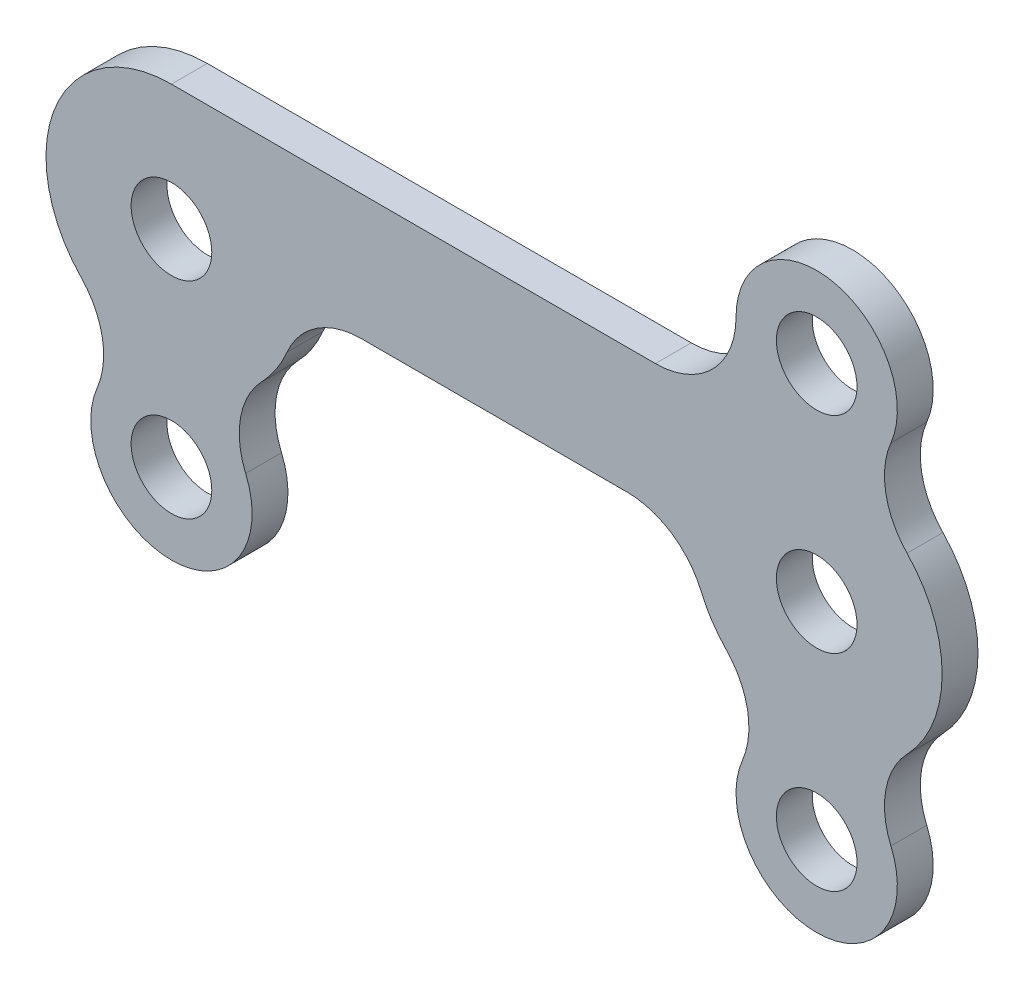
ISO-10303-21;
HEADER;
FILE_DESCRIPTION(('STEP AP214'),'2;1');
FILE_NAME('part.step','',(''),(''),'','','');
FILE_SCHEMA(('AUTOMOTIVE_DESIGN { 1 0 10303 214 1 1 1 1 }'));
ENDSEC;
DATA;
#1=APPLICATION_CONTEXT('core data for automotive mechanical design processes');
#2=APPLICATION_PROTOCOL_DEFINITION('international standard','automotive_design',2000,#1);
#3=PRODUCT_CONTEXT('',#1,'mechanical');
#4=PRODUCT('Part','Part','',(#3));
#5=PRODUCT_RELATED_PRODUCT_CATEGORY('part','',(#4));
#6=PRODUCT_DEFINITION_FORMATION('','',#4);
#7=PRODUCT_DEFINITION_CONTEXT('part definition',#1,'design');
#8=PRODUCT_DEFINITION('design','',#6,#7);
#9=PRODUCT_DEFINITION_SHAPE('','',#8);
#10=(LENGTH_UNIT() NAMED_UNIT(*) SI_UNIT(.MILLI.,.METRE.));
#11=(NAMED_UNIT(*) PLANE_ANGLE_UNIT() SI_UNIT($,.RADIAN.));
#12=(NAMED_UNIT(*) SI_UNIT($,.STERADIAN.) SOLID_ANGLE_UNIT());
#13=UNCERTAINTY_MEASURE_WITH_UNIT(LENGTH_MEASURE(1.E-05),#10,'distance_accuracy_value','');
#14=(GEOMETRIC_REPRESENTATION_CONTEXT(3) GLOBAL_UNCERTAINTY_ASSIGNED_CONTEXT((#13)) GLOBAL_UNIT_ASSIGNED_CONTEXT((#10,
#11,#12)) REPRESENTATION_CONTEXT('',''));
#15=CARTESIAN_POINT('',(0.,0.,0.));
#16=DIRECTION('',(0.,0.,1.));
#17=DIRECTION('',(1.,0.,0.));
#18=AXIS2_PLACEMENT_3D('',#15,#16,#17);
#19=CARTESIAN_POINT('',(35.149116844667,6.33274456521738,1.5875));
#20=DIRECTION('',(0.,0.,-1.));
#21=DIRECTION('',(-1.,0.,0.));
#22=AXIS2_PLACEMENT_3D('',#19,#20,#21);
#23=CYLINDRICAL_SURFACE('',#22,3.571875);
#24=CARTESIAN_POINT('',(35.149116844667,6.33274456521738,0.));
#25=DIRECTION('',(0.,0.,1.));
#26=DIRECTION('',(1.,0.,0.));
#27=AXIS2_PLACEMENT_3D('',#24,#25,#26);
#28=CIRCLE('',#27,3.571875);
#29=CARTESIAN_POINT('',(31.8620584223335,7.7304347826087,0.));
#30=VERTEX_POINT('',#29);
#31=CARTESIAN_POINT('',(32.5766363402321,3.8547140831758,0.));
#32=VERTEX_POINT('',#31);
#33=EDGE_CURVE('E165',#30,#32,#28,.T.);
#34=ORIENTED_EDGE('',*,*,#33,.F.);
#35=DIRECTION('',(0.,0.,-1.));
#36=VECTOR('',#35,1.);
#37=CARTESIAN_POINT('',(31.8620584223335,7.7304347826087,1.5875));
#38=LINE('',#37,#36);
#39=CARTESIAN_POINT('',(31.8620584223335,7.7304347826087,1.5875));
#40=VERTEX_POINT('',#39);
#41=EDGE_CURVE('E160',#40,#30,#38,.T.);
#42=ORIENTED_EDGE('',*,*,#41,.F.);
#43=CARTESIAN_POINT('',(35.149116844667,6.33274456521738,1.5875));
#44=DIRECTION('',(0.,0.,1.));
#45=DIRECTION('',(1.,0.,0.));
#46=AXIS2_PLACEMENT_3D('',#43,#44,#45);
#47=CIRCLE('',#46,3.571875);
#48=CARTESIAN_POINT('',(32.5766363402321,3.8547140831758,1.5875));
#49=VERTEX_POINT('',#48);
#50=EDGE_CURVE('E163',#40,#49,#47,.T.);
#51=ORIENTED_EDGE('',*,*,#50,.T.);
#52=DIRECTION('',(0.,0.,-1.));
#53=VECTOR('',#52,1.);
#54=CARTESIAN_POINT('',(32.5766363402321,3.8547140831758,1.5875));
#55=LINE('',#54,#53);
#56=EDGE_CURVE('E253',#49,#32,#55,.T.);
#57=ORIENTED_EDGE('',*,*,#56,.T.);
#58=EDGE_LOOP('',(#34,#42,#51,#57));
#59=FACE_BOUND('',#58,.T.);
#60=ADVANCED_FACE('F41',(#59),#23,.F.);
#61=CARTESIAN_POINT('',(28.575,9.12812500000001,1.5875));
#62=DIRECTION('',(0.,0.,-1.));
#63=DIRECTION('',(-1.,0.,0.));
#64=AXIS2_PLACEMENT_3D('',#61,#62,#63);
#65=CYLINDRICAL_SURFACE('',#64,3.57187499999999);
#66=CARTESIAN_POINT('',(28.575,9.12812500000001,0.));
#67=DIRECTION('',(0.,0.,1.));
#68=DIRECTION('',(1.,0.,0.));
#69=AXIS2_PLACEMENT_3D('',#66,#67,#68);
#70=CIRCLE('',#69,3.57187499999999);
#71=CARTESIAN_POINT('',(25.003125,9.12812500000001,0.));
#72=VERTEX_POINT('',#71);
#73=EDGE_CURVE('E256',#30,#72,#70,.T.);
#74=ORIENTED_EDGE('',*,*,#73,.T.);
#75=DIRECTION('',(0.,0.,-1.));
#76=VECTOR('',#75,1.);
#77=CARTESIAN_POINT('',(25.003125,9.12812500000001,1.5875));
#78=LINE('',#77,#76);
#79=CARTESIAN_POINT('',(25.003125,9.12812500000001,1.5875));
#80=VERTEX_POINT('',#79);
#81=EDGE_CURVE('E171',#80,#72,#78,.T.);
#82=ORIENTED_EDGE('',*,*,#81,.F.);
#83=CARTESIAN_POINT('',(28.575,9.12812500000001,1.5875));
#84=DIRECTION('',(0.,0.,1.));
#85=DIRECTION('',(1.,0.,0.));
#86=AXIS2_PLACEMENT_3D('',#83,#84,#85);
#87=CIRCLE('',#86,3.57187499999999);
#88=EDGE_CURVE('E174',#40,#80,#87,.T.);
#89=ORIENTED_EDGE('',*,*,#88,.F.);
#90=ORIENTED_EDGE('',*,*,#41,.T.);
#91=EDGE_LOOP('',(#74,#82,#89,#90));
#92=FACE_BOUND('',#91,.T.);
#93=ADVANCED_FACE('F175',(#92),#65,.T.);
#94=CARTESIAN_POINT('',(21.43125,9.12812500000001,1.5875));
#95=DIRECTION('',(0.,0.,-1.));
#96=DIRECTION('',(-1.,0.,0.));
#97=AXIS2_PLACEMENT_3D('',#94,#95,#96);
#98=CYLINDRICAL_SURFACE('',#97,3.571875);
#99=CARTESIAN_POINT('',(21.43125,9.12812500000001,0.));
#100=DIRECTION('',(0.,0.,1.));
#101=DIRECTION('',(1.,0.,0.));
#102=AXIS2_PLACEMENT_3D('',#99,#100,#101);
#103=CIRCLE('',#102,3.571875);
#104=CARTESIAN_POINT('',(21.43125,5.55625000000001,0.));
#105=VERTEX_POINT('',#104);
#106=EDGE_CURVE('E259',#105,#72,#103,.T.);
#107=ORIENTED_EDGE('',*,*,#106,.F.);
#108=DIRECTION('',(0.,0.,-1.));
#109=VECTOR('',#108,1.);
#110=CARTESIAN_POINT('',(21.43125,5.55625000000001,1.5875));
#111=LINE('',#110,#109);
#112=CARTESIAN_POINT('',(21.43125,5.55625000000001,1.5875));
#113=VERTEX_POINT('',#112);
#114=EDGE_CURVE('E349',#113,#105,#111,.T.);
#115=ORIENTED_EDGE('',*,*,#114,.F.);
#116=CARTESIAN_POINT('',(21.43125,9.12812500000001,1.5875));
#117=DIRECTION('',(0.,0.,1.));
#118=DIRECTION('',(1.,0.,0.));
#119=AXIS2_PLACEMENT_3D('',#116,#117,#118);
#120=CIRCLE('',#119,3.571875);
#121=EDGE_CURVE('E179',#113,#80,#120,.T.);
#122=ORIENTED_EDGE('',*,*,#121,.T.);
#123=ORIENTED_EDGE('',*,*,#81,.T.);
#124=EDGE_LOOP('',(#107,#115,#122,#123));
#125=FACE_BOUND('',#124,.T.);
#126=ADVANCED_FACE('F420',(#125),#98,.F.);
#127=CARTESIAN_POINT('',(0.,5.55625000000001,1.5875));
#128=DIRECTION('',(0.,1.,0.));
#129=DIRECTION('',(0.,0.,1.));
#130=AXIS2_PLACEMENT_3D('',#127,#128,#129);
#131=PLANE('',#130);
#132=DIRECTION('',(1.,0.,0.));
#133=VECTOR('',#132,1.);
#134=CARTESIAN_POINT('',(0.,5.55625000000001,0.));
#135=LINE('',#134,#133);
#136=CARTESIAN_POINT('',(0.,5.55625000000001,0.));
#137=VERTEX_POINT('',#136);
#138=EDGE_CURVE('E263',#137,#105,#135,.T.);
#139=ORIENTED_EDGE('',*,*,#138,.F.);
#140=DIRECTION('',(0.,0.,-1.));
#141=VECTOR('',#140,1.);
#142=CARTESIAN_POINT('',(0.,5.55625000000001,1.5875));
#143=LINE('',#142,#141);
#144=CARTESIAN_POINT('',(0.,5.55625000000001,1.5875));
#145=VERTEX_POINT('',#144);
#146=EDGE_CURVE('E346',#145,#137,#143,.T.);
#147=ORIENTED_EDGE('',*,*,#146,.F.);
#148=DIRECTION('',(1.,0.,0.));
#149=VECTOR('',#148,1.);
#150=CARTESIAN_POINT('',(0.,5.55625000000001,1.5875));
#151=LINE('',#150,#149);
#152=EDGE_CURVE('E197',#145,#113,#151,.T.);
#153=ORIENTED_EDGE('',*,*,#152,.T.);
#154=ORIENTED_EDGE('',*,*,#114,.T.);
#155=EDGE_LOOP('',(#139,#147,#153,#154));
#156=FACE_BOUND('',#155,.T.);
#157=ADVANCED_FACE('F423',(#156),#131,.T.);
#158=CARTESIAN_POINT('',(0.,0.,1.5875));
#159=DIRECTION('',(0.,0.,-1.));
#160=DIRECTION('',(-1.,0.,0.));
#161=AXIS2_PLACEMENT_3D('',#158,#159,#160);
#162=CYLINDRICAL_SURFACE('',#161,5.55625);
#163=CARTESIAN_POINT('',(0.,0.,0.));
#164=DIRECTION('',(0.,0.,1.));
#165=DIRECTION('',(1.,0.,0.));
#166=AXIS2_PLACEMENT_3D('',#163,#164,#165);
#167=CIRCLE('',#166,5.55625);
#168=CARTESIAN_POINT('',(-4.0016363402321,-3.8547140831758,0.));
#169=VERTEX_POINT('',#168);
#170=EDGE_CURVE('E267',#137,#169,#167,.T.);
#171=ORIENTED_EDGE('',*,*,#170,.T.);
#172=DIRECTION('',(0.,0.,-1.));
#173=VECTOR('',#172,1.);
#174=CARTESIAN_POINT('',(-4.0016363402321,-3.8547140831758,1.5875));
#175=LINE('',#174,#173);
#176=CARTESIAN_POINT('',(-4.0016363402321,-3.8547140831758,1.5875));
#177=VERTEX_POINT('',#176);
#178=EDGE_CURVE('E343',#177,#169,#175,.T.);
#179=ORIENTED_EDGE('',*,*,#178,.F.);
#180=CARTESIAN_POINT('',(0.,0.,1.5875));
#181=DIRECTION('',(0.,0.,1.));
#182=DIRECTION('',(1.,0.,0.));
#183=AXIS2_PLACEMENT_3D('',#180,#181,#182);
#184=CIRCLE('',#183,5.55625);
#185=EDGE_CURVE('E201',#145,#177,#184,.T.);
#186=ORIENTED_EDGE('',*,*,#185,.F.);
#187=ORIENTED_EDGE('',*,*,#146,.T.);
#188=EDGE_LOOP('',(#171,#179,#186,#187));
#189=FACE_BOUND('',#188,.T.);
#190=ADVANCED_FACE('F427',(#189),#162,.T.);
#191=CARTESIAN_POINT('',(-6.57411684466701,-6.33274456521737,1.5875));
#192=DIRECTION('',(0.,0.,-1.));
#193=DIRECTION('',(-1.,0.,0.));
#194=AXIS2_PLACEMENT_3D('',#191,#192,#193);
#195=CYLINDRICAL_SURFACE('',#194,3.57187499999999);
#196=CARTESIAN_POINT('',(-6.57411684466701,-6.33274456521737,0.));
#197=DIRECTION('',(0.,0.,1.));
#198=DIRECTION('',(1.,0.,0.));
#199=AXIS2_PLACEMENT_3D('',#196,#197,#198);
#200=CIRCLE('',#199,3.57187499999999);
#201=CARTESIAN_POINT('',(-3.2870584223335,-7.73043478260869,0.));
#202=VERTEX_POINT('',#201);
#203=EDGE_CURVE('E271',#202,#169,#200,.T.);
#204=ORIENTED_EDGE('',*,*,#203,.F.);
#205=DIRECTION('',(0.,0.,-1.));
#206=VECTOR('',#205,1.);
#207=CARTESIAN_POINT('',(-3.2870584223335,-7.73043478260869,1.5875));
#208=LINE('',#207,#206);
#209=CARTESIAN_POINT('',(-3.2870584223335,-7.73043478260869,1.5875));
#210=VERTEX_POINT('',#209);
#211=EDGE_CURVE('E340',#210,#202,#208,.T.);
#212=ORIENTED_EDGE('',*,*,#211,.F.);
#213=CARTESIAN_POINT('',(-6.57411684466701,-6.33274456521737,1.5875));
#214=DIRECTION('',(0.,0.,1.));
#215=DIRECTION('',(1.,0.,0.));
#216=AXIS2_PLACEMENT_3D('',#213,#214,#215);
#217=CIRCLE('',#216,3.57187499999999);
#218=EDGE_CURVE('E204',#210,#177,#217,.T.);
#219=ORIENTED_EDGE('',*,*,#218,.T.);
#220=ORIENTED_EDGE('',*,*,#178,.T.);
#221=EDGE_LOOP('',(#204,#212,#219,#220));
#222=FACE_BOUND('',#221,.T.);
#223=ADVANCED_FACE('F433',(#222),#195,.F.);
#224=CARTESIAN_POINT('',(0.,-9.12812499999999,1.5875));
#225=DIRECTION('',(0.,0.,-1.));
#226=DIRECTION('',(-1.,0.,0.));
#227=AXIS2_PLACEMENT_3D('',#224,#225,#226);
#228=CYLINDRICAL_SURFACE('',#227,3.57187499999999);
#229=CARTESIAN_POINT('',(0.,-9.12812499999999,0.));
#230=DIRECTION('',(0.,0.,1.));
#231=DIRECTION('',(1.,0.,0.));
#232=AXIS2_PLACEMENT_3D('',#229,#230,#231);
#233=CIRCLE('',#232,3.57187499999999);
#234=CARTESIAN_POINT('',(3.2870584223335,-7.7304347826087,0.));
#235=VERTEX_POINT('',#234);
#236=EDGE_CURVE('E276',#202,#235,#233,.T.);
#237=ORIENTED_EDGE('',*,*,#236,.T.);
#238=DIRECTION('',(0.,0.,-1.));
#239=VECTOR('',#238,1.);
#240=CARTESIAN_POINT('',(3.2870584223335,-7.7304347826087,1.5875));
#241=LINE('',#240,#239);
#242=CARTESIAN_POINT('',(3.2870584223335,-7.7304347826087,1.5875));
#243=VERTEX_POINT('',#242);
#244=EDGE_CURVE('E337',#243,#235,#241,.T.);
#245=ORIENTED_EDGE('',*,*,#244,.F.);
#246=CARTESIAN_POINT('',(0.,-9.12812499999999,1.5875));
#247=DIRECTION('',(0.,0.,1.));
#248=DIRECTION('',(1.,0.,0.));
#249=AXIS2_PLACEMENT_3D('',#246,#247,#248);
#250=CIRCLE('',#249,3.57187499999999);
#251=EDGE_CURVE('E209',#210,#243,#250,.T.);
#252=ORIENTED_EDGE('',*,*,#251,.F.);
#253=ORIENTED_EDGE('',*,*,#211,.T.);
#254=EDGE_LOOP('',(#237,#245,#252,#253));
#255=FACE_BOUND('',#254,.T.);
#256=ADVANCED_FACE('F436',(#255),#228,.T.);
#257=CARTESIAN_POINT('',(6.57411684466702,-6.33274456521739,1.5875));
#258=DIRECTION('',(0.,0.,-1.));
#259=DIRECTION('',(-1.,0.,0.));
#260=AXIS2_PLACEMENT_3D('',#257,#258,#259);
#261=CYLINDRICAL_SURFACE('',#260,3.57187500000001);
#262=CARTESIAN_POINT('',(6.57411684466702,-6.33274456521739,0.));
#263=DIRECTION('',(0.,0.,1.));
#264=DIRECTION('',(1.,0.,0.));
#265=AXIS2_PLACEMENT_3D('',#262,#263,#264);
#266=CIRCLE('',#265,3.57187500000001);
#267=CARTESIAN_POINT('',(4.0016363402321,-3.8547140831758,0.));
#268=VERTEX_POINT('',#267);
#269=EDGE_CURVE('E280',#268,#235,#266,.T.);
#270=ORIENTED_EDGE('',*,*,#269,.F.);
#271=DIRECTION('',(0.,0.,-1.));
#272=VECTOR('',#271,1.);
#273=CARTESIAN_POINT('',(4.0016363402321,-3.8547140831758,1.5875));
#274=LINE('',#273,#272);
#275=CARTESIAN_POINT('',(4.0016363402321,-3.8547140831758,1.5875));
#276=VERTEX_POINT('',#275);
#277=EDGE_CURVE('E334',#276,#268,#274,.T.);
#278=ORIENTED_EDGE('',*,*,#277,.F.);
#279=CARTESIAN_POINT('',(6.57411684466702,-6.33274456521739,1.5875));
#280=DIRECTION('',(0.,0.,1.));
#281=DIRECTION('',(1.,0.,0.));
#282=AXIS2_PLACEMENT_3D('',#279,#280,#281);
#283=CIRCLE('',#282,3.57187500000001);
#284=EDGE_CURVE('E212',#276,#243,#283,.T.);
#285=ORIENTED_EDGE('',*,*,#284,.T.);
#286=ORIENTED_EDGE('',*,*,#244,.T.);
#287=EDGE_LOOP('',(#270,#278,#285,#286));
#288=FACE_BOUND('',#287,.T.);
#289=ADVANCED_FACE('F438',(#288),#261,.F.);
#290=CARTESIAN_POINT('',(5.11320199029657,-2.17418478260869,0.));
#291=VERTEX_POINT('',#290);
#292=EDGE_CURVE('E272',#268,#291,#167,.T.);
#293=ORIENTED_EDGE('',*,*,#292,.T.);
#294=DIRECTION('',(0.,0.,-1.));
#295=VECTOR('',#294,1.);
#296=CARTESIAN_POINT('',(5.11320199029657,-2.17418478260869,1.5875));
#297=LINE('',#296,#295);
#298=CARTESIAN_POINT('',(5.11320199029657,-2.17418478260869,1.5875));
#299=VERTEX_POINT('',#298);
#300=EDGE_CURVE('E360',#291,#299,#297,.F.);
#301=ORIENTED_EDGE('',*,*,#300,.T.);
#302=EDGE_CURVE('E205',#276,#299,#184,.T.);
#303=ORIENTED_EDGE('',*,*,#302,.F.);
#304=ORIENTED_EDGE('',*,*,#277,.T.);
#305=EDGE_LOOP('',(#293,#301,#303,#304));
#306=FACE_BOUND('',#305,.T.);
#307=ADVANCED_FACE('F413',(#306),#162,.T.);
#308=CARTESIAN_POINT('',(0.,0.,1.5875));
#309=DIRECTION('',(0.,1.,0.));
#310=DIRECTION('',(0.,0.,1.));
#311=AXIS2_PLACEMENT_3D('',#308,#309,#310);
#312=PLANE('',#311);
#313=DIRECTION('',(1.,0.,0.));
#314=VECTOR('',#313,1.);
#315=CARTESIAN_POINT('',(0.,0.,1.5875));
#316=LINE('',#315,#314);
#317=CARTESIAN_POINT('',(8.40026041263007,0.,1.5875));
#318=VERTEX_POINT('',#317);
#319=CARTESIAN_POINT('',(20.1747395873699,0.,1.5875));
#320=VERTEX_POINT('',#319);
#321=EDGE_CURVE('E216',#318,#320,#316,.T.);
#322=ORIENTED_EDGE('',*,*,#321,.F.);
#323=DIRECTION('',(0.,0.,1.));
#324=VECTOR('',#323,1.);
#325=CARTESIAN_POINT('',(8.40026041263007,0.,0.));
#326=LINE('',#325,#324);
#327=CARTESIAN_POINT('',(8.40026041263007,0.,0.));
#328=VERTEX_POINT('',#327);
#329=EDGE_CURVE('E356',#318,#328,#326,.F.);
#330=ORIENTED_EDGE('',*,*,#329,.T.);
#331=DIRECTION('',(1.,0.,0.));
#332=VECTOR('',#331,1.);
#333=CARTESIAN_POINT('',(0.,0.,0.));
#334=LINE('',#333,#332);
#335=CARTESIAN_POINT('',(20.1747395873699,0.,0.));
#336=VERTEX_POINT('',#335);
#337=EDGE_CURVE('E284',#328,#336,#334,.T.);
#338=ORIENTED_EDGE('',*,*,#337,.T.);
#339=DIRECTION('',(0.,0.,1.));
#340=VECTOR('',#339,1.);
#341=CARTESIAN_POINT('',(20.1747395873699,0.,1.5875));
#342=LINE('',#341,#340);
#343=EDGE_CURVE('E170',#336,#320,#342,.T.);
#344=ORIENTED_EDGE('',*,*,#343,.T.);
#345=EDGE_LOOP('',(#322,#330,#338,#344));
#346=FACE_BOUND('',#345,.T.);
#347=ADVANCED_FACE('F379',(#346),#312,.F.);
#348=CARTESIAN_POINT('',(28.575,0.,1.5875));
#349=DIRECTION('',(0.,0.,-1.));
#350=DIRECTION('',(-1.,0.,0.));
#351=AXIS2_PLACEMENT_3D('',#348,#349,#350);
#352=CYLINDRICAL_SURFACE('',#351,5.55624999999999);
#353=CARTESIAN_POINT('',(28.575,0.,1.5875));
#354=DIRECTION('',(0.,0.,1.));
#355=DIRECTION('',(1.,0.,0.));
#356=AXIS2_PLACEMENT_3D('',#353,#354,#355);
#357=CIRCLE('',#356,5.55624999999999);
#358=CARTESIAN_POINT('',(23.4617980097034,-2.1741847826087,1.5875));
#359=VERTEX_POINT('',#358);
#360=CARTESIAN_POINT('',(24.5733636597679,-3.85471408317579,1.5875));
#361=VERTEX_POINT('',#360);
#362=EDGE_CURVE('E219',#359,#361,#357,.T.);
#363=ORIENTED_EDGE('',*,*,#362,.F.);
#364=DIRECTION('',(0.,0.,-1.));
#365=VECTOR('',#364,1.);
#366=CARTESIAN_POINT('',(23.4617980097034,-2.17418478260869,1.5875));
#367=LINE('',#366,#365);
#368=CARTESIAN_POINT('',(23.4617980097034,-2.1741847826087,0.));
#369=VERTEX_POINT('',#368);
#370=EDGE_CURVE('E363',#359,#369,#367,.T.);
#371=ORIENTED_EDGE('',*,*,#370,.T.);
#372=CARTESIAN_POINT('',(28.575,0.,0.));
#373=DIRECTION('',(0.,0.,1.));
#374=DIRECTION('',(1.,0.,0.));
#375=AXIS2_PLACEMENT_3D('',#372,#373,#374);
#376=CIRCLE('',#375,5.55624999999999);
#377=CARTESIAN_POINT('',(24.5733636597679,-3.85471408317579,0.));
#378=VERTEX_POINT('',#377);
#379=EDGE_CURVE('E288',#369,#378,#376,.T.);
#380=ORIENTED_EDGE('',*,*,#379,.T.);
#381=DIRECTION('',(0.,0.,-1.));
#382=VECTOR('',#381,1.);
#383=CARTESIAN_POINT('',(24.5733636597679,-3.85471408317579,1.5875));
#384=LINE('',#383,#382);
#385=EDGE_CURVE('E330',#361,#378,#384,.T.);
#386=ORIENTED_EDGE('',*,*,#385,.F.);
#387=EDGE_LOOP('',(#363,#371,#380,#386));
#388=FACE_BOUND('',#387,.T.);
#389=ADVANCED_FACE('F382',(#388),#352,.T.);
#390=CARTESIAN_POINT('',(22.000883155333,-6.33274456521738,1.5875));
#391=DIRECTION('',(0.,0.,-1.));
#392=DIRECTION('',(-1.,0.,0.));
#393=AXIS2_PLACEMENT_3D('',#390,#391,#392);
#394=CYLINDRICAL_SURFACE('',#393,3.57187499999999);
#395=CARTESIAN_POINT('',(22.000883155333,-6.33274456521738,0.));
#396=DIRECTION('',(0.,0.,1.));
#397=DIRECTION('',(1.,0.,0.));
#398=AXIS2_PLACEMENT_3D('',#395,#396,#397);
#399=CIRCLE('',#398,3.57187499999999);
#400=CARTESIAN_POINT('',(25.2879415776665,-7.73043478260869,0.));
#401=VERTEX_POINT('',#400);
#402=EDGE_CURVE('E291',#401,#378,#399,.T.);
#403=ORIENTED_EDGE('',*,*,#402,.F.);
#404=DIRECTION('',(0.,0.,-1.));
#405=VECTOR('',#404,1.);
#406=CARTESIAN_POINT('',(25.2879415776665,-7.73043478260869,1.5875));
#407=LINE('',#406,#405);
#408=CARTESIAN_POINT('',(25.2879415776665,-7.73043478260869,1.5875));
#409=VERTEX_POINT('',#408);
#410=EDGE_CURVE('E327',#409,#401,#407,.T.);
#411=ORIENTED_EDGE('',*,*,#410,.F.);
#412=CARTESIAN_POINT('',(22.000883155333,-6.33274456521738,1.5875));
#413=DIRECTION('',(0.,0.,1.));
#414=DIRECTION('',(1.,0.,0.));
#415=AXIS2_PLACEMENT_3D('',#412,#413,#414);
#416=CIRCLE('',#415,3.57187499999999);
#417=EDGE_CURVE('E222',#409,#361,#416,.T.);
#418=ORIENTED_EDGE('',*,*,#417,.T.);
#419=ORIENTED_EDGE('',*,*,#385,.T.);
#420=EDGE_LOOP('',(#403,#411,#418,#419));
#421=FACE_BOUND('',#420,.T.);
#422=ADVANCED_FACE('F389',(#421),#394,.F.);
#423=CARTESIAN_POINT('',(28.575,-9.12812499999999,1.5875));
#424=DIRECTION('',(0.,0.,-1.));
#425=DIRECTION('',(-1.,0.,0.));
#426=AXIS2_PLACEMENT_3D('',#423,#424,#425);
#427=CYLINDRICAL_SURFACE('',#426,3.57187499999999);
#428=CARTESIAN_POINT('',(28.575,-9.12812499999999,0.));
#429=DIRECTION('',(0.,0.,1.));
#430=DIRECTION('',(1.,0.,0.));
#431=AXIS2_PLACEMENT_3D('',#428,#429,#430);
#432=CIRCLE('',#431,3.57187499999999);
#433=CARTESIAN_POINT('',(31.8620584223335,-7.73043478260869,0.));
#434=VERTEX_POINT('',#433);
#435=EDGE_CURVE('E296',#401,#434,#432,.T.);
#436=ORIENTED_EDGE('',*,*,#435,.T.);
#437=DIRECTION('',(0.,0.,-1.));
#438=VECTOR('',#437,1.);
#439=CARTESIAN_POINT('',(31.8620584223335,-7.73043478260869,1.5875));
#440=LINE('',#439,#438);
#441=CARTESIAN_POINT('',(31.8620584223335,-7.73043478260869,1.5875));
#442=VERTEX_POINT('',#441);
#443=EDGE_CURVE('E324',#442,#434,#440,.T.);
#444=ORIENTED_EDGE('',*,*,#443,.F.);
#445=CARTESIAN_POINT('',(28.575,-9.12812499999999,1.5875));
#446=DIRECTION('',(0.,0.,1.));
#447=DIRECTION('',(1.,0.,0.));
#448=AXIS2_PLACEMENT_3D('',#445,#446,#447);
#449=CIRCLE('',#448,3.57187499999999);
#450=EDGE_CURVE('E226',#409,#442,#449,.T.);
#451=ORIENTED_EDGE('',*,*,#450,.F.);
#452=ORIENTED_EDGE('',*,*,#410,.T.);
#453=EDGE_LOOP('',(#436,#444,#451,#452));
#454=FACE_BOUND('',#453,.T.);
#455=ADVANCED_FACE('F392',(#454),#427,.T.);
#456=CARTESIAN_POINT('',(35.149116844667,-6.33274456521738,1.5875));
#457=DIRECTION('',(0.,0.,-1.));
#458=DIRECTION('',(-1.,0.,0.));
#459=AXIS2_PLACEMENT_3D('',#456,#457,#458);
#460=CYLINDRICAL_SURFACE('',#459,3.571875);
#461=CARTESIAN_POINT('',(35.149116844667,-6.33274456521738,0.));
#462=DIRECTION('',(0.,0.,1.));
#463=DIRECTION('',(1.,0.,0.));
#464=AXIS2_PLACEMENT_3D('',#461,#462,#463);
#465=CIRCLE('',#464,3.571875);
#466=CARTESIAN_POINT('',(32.5766363402321,-3.85471408317579,0.));
#467=VERTEX_POINT('',#466);
#468=EDGE_CURVE('E300',#467,#434,#465,.T.);
#469=ORIENTED_EDGE('',*,*,#468,.F.);
#470=DIRECTION('',(0.,0.,-1.));
#471=VECTOR('',#470,1.);
#472=CARTESIAN_POINT('',(32.5766363402321,-3.85471408317579,1.5875));
#473=LINE('',#472,#471);
#474=CARTESIAN_POINT('',(32.5766363402321,-3.85471408317579,1.5875));
#475=VERTEX_POINT('',#474);
#476=EDGE_CURVE('E321',#475,#467,#473,.T.);
#477=ORIENTED_EDGE('',*,*,#476,.F.);
#478=CARTESIAN_POINT('',(35.149116844667,-6.33274456521738,1.5875));
#479=DIRECTION('',(0.,0.,1.));
#480=DIRECTION('',(1.,0.,0.));
#481=AXIS2_PLACEMENT_3D('',#478,#479,#480);
#482=CIRCLE('',#481,3.571875);
#483=EDGE_CURVE('E229',#475,#442,#482,.T.);
#484=ORIENTED_EDGE('',*,*,#483,.T.);
#485=ORIENTED_EDGE('',*,*,#443,.T.);
#486=EDGE_LOOP('',(#469,#477,#484,#485));
#487=FACE_BOUND('',#486,.T.);
#488=ADVANCED_FACE('F395',(#487),#460,.F.);
#489=CARTESIAN_POINT('',(28.575,9.12812500000001,1.5875));
#490=DIRECTION('',(0.,0.,-1.));
#491=DIRECTION('',(-1.,0.,0.));
#492=AXIS2_PLACEMENT_3D('',#489,#490,#491);
#493=CYLINDRICAL_SURFACE('',#492,1.7859375);
#494=CARTESIAN_POINT('',(28.575,9.12812500000001,1.5875));
#495=DIRECTION('',(0.,0.,1.));
#496=DIRECTION('',(1.,0.,0.));
#497=AXIS2_PLACEMENT_3D('',#494,#495,#496);
#498=CIRCLE('',#497,1.7859375);
#499=CARTESIAN_POINT('',(30.3609375,9.12812500000001,1.5875));
#500=VERTEX_POINT('',#499);
#501=EDGE_CURVE('E245',#500,#500,#498,.T.);
#502=ORIENTED_EDGE('',*,*,#501,.T.);
#503=EDGE_LOOP('',(#502));
#504=FACE_BOUND('',#503,.T.);
#505=CARTESIAN_POINT('',(28.575,9.12812500000001,0.));
#506=DIRECTION('',(0.,0.,1.));
#507=DIRECTION('',(1.,0.,0.));
#508=AXIS2_PLACEMENT_3D('',#505,#506,#507);
#509=CIRCLE('',#508,1.7859375);
#510=CARTESIAN_POINT('',(30.3609375,9.12812500000001,0.));
#511=VERTEX_POINT('',#510);
#512=EDGE_CURVE('E192',#511,#511,#509,.T.);
#513=ORIENTED_EDGE('',*,*,#512,.F.);
#514=EDGE_LOOP('',(#513));
#515=FACE_BOUND('',#514,.T.);
#516=ADVANCED_FACE('F469',(#504,#515),#493,.F.);
#517=CARTESIAN_POINT('',(28.575,0.,1.5875));
#518=DIRECTION('',(0.,0.,-1.));
#519=DIRECTION('',(-1.,0.,0.));
#520=AXIS2_PLACEMENT_3D('',#517,#518,#519);
#521=CYLINDRICAL_SURFACE('',#520,1.7859375);
#522=CARTESIAN_POINT('',(28.575,0.,1.5875));
#523=DIRECTION('',(0.,0.,1.));
#524=DIRECTION('',(1.,0.,0.));
#525=AXIS2_PLACEMENT_3D('',#522,#523,#524);
#526=CIRCLE('',#525,1.7859375);
#527=CARTESIAN_POINT('',(30.3609375,0.,1.5875));
#528=VERTEX_POINT('',#527);
#529=EDGE_CURVE('E241',#528,#528,#526,.T.);
#530=ORIENTED_EDGE('',*,*,#529,.T.);
#531=EDGE_LOOP('',(#530));
#532=FACE_BOUND('',#531,.T.);
#533=CARTESIAN_POINT('',(28.575,0.,0.));
#534=DIRECTION('',(0.,0.,1.));
#535=DIRECTION('',(1.,0.,0.));
#536=AXIS2_PLACEMENT_3D('',#533,#534,#535);
#537=CIRCLE('',#536,1.7859375);
#538=CARTESIAN_POINT('',(30.3609375,0.,0.));
#539=VERTEX_POINT('',#538);
#540=EDGE_CURVE('E312',#539,#539,#537,.T.);
#541=ORIENTED_EDGE('',*,*,#540,.F.);
#542=EDGE_LOOP('',(#541));
#543=FACE_BOUND('',#542,.T.);
#544=ADVANCED_FACE('F472',(#532,#543),#521,.F.);
#545=CARTESIAN_POINT('',(0.,0.,1.5875));
#546=DIRECTION('',(0.,0.,-1.));
#547=DIRECTION('',(-1.,0.,0.));
#548=AXIS2_PLACEMENT_3D('',#545,#546,#547);
#549=CYLINDRICAL_SURFACE('',#548,1.7859375);
#550=CARTESIAN_POINT('',(0.,0.,1.5875));
#551=DIRECTION('',(0.,0.,1.));
#552=DIRECTION('',(1.,0.,0.));
#553=AXIS2_PLACEMENT_3D('',#550,#551,#552);
#554=CIRCLE('',#553,1.7859375);
#555=CARTESIAN_POINT('',(1.7859375,0.,1.5875));
#556=VERTEX_POINT('',#555);
#557=EDGE_CURVE('E237',#556,#556,#554,.T.);
#558=ORIENTED_EDGE('',*,*,#557,.T.);
#559=EDGE_LOOP('',(#558));
#560=FACE_BOUND('',#559,.T.);
#561=CARTESIAN_POINT('',(0.,0.,0.));
#562=DIRECTION('',(0.,0.,1.));
#563=DIRECTION('',(1.,0.,0.));
#564=AXIS2_PLACEMENT_3D('',#561,#562,#563);
#565=CIRCLE('',#564,1.7859375);
#566=CARTESIAN_POINT('',(1.7859375,0.,0.));
#567=VERTEX_POINT('',#566);
#568=EDGE_CURVE('E308',#567,#567,#565,.T.);
#569=ORIENTED_EDGE('',*,*,#568,.F.);
#570=EDGE_LOOP('',(#569));
#571=FACE_BOUND('',#570,.T.);
#572=ADVANCED_FACE('F476',(#560,#571),#549,.F.);
#573=CARTESIAN_POINT('',(0.,-9.12812499999999,1.5875));
#574=DIRECTION('',(0.,0.,-1.));
#575=DIRECTION('',(-1.,0.,0.));
#576=AXIS2_PLACEMENT_3D('',#573,#574,#575);
#577=CYLINDRICAL_SURFACE('',#576,1.7859375);
#578=CARTESIAN_POINT('',(0.,-9.12812499999999,1.5875));
#579=DIRECTION('',(0.,0.,1.));
#580=DIRECTION('',(1.,0.,0.));
#581=AXIS2_PLACEMENT_3D('',#578,#579,#580);
#582=CIRCLE('',#581,1.7859375);
#583=CARTESIAN_POINT('',(1.7859375,-9.12812499999999,1.5875));
#584=VERTEX_POINT('',#583);
#585=EDGE_CURVE('E233',#584,#584,#582,.T.);
#586=ORIENTED_EDGE('',*,*,#585,.T.);
#587=EDGE_LOOP('',(#586));
#588=FACE_BOUND('',#587,.T.);
#589=CARTESIAN_POINT('',(0.,-9.12812499999999,0.));
#590=DIRECTION('',(0.,0.,1.));
#591=DIRECTION('',(1.,0.,0.));
#592=AXIS2_PLACEMENT_3D('',#589,#590,#591);
#593=CIRCLE('',#592,1.7859375);
#594=CARTESIAN_POINT('',(1.7859375,-9.12812499999999,0.));
#595=VERTEX_POINT('',#594);
#596=EDGE_CURVE('E304',#595,#595,#593,.T.);
#597=ORIENTED_EDGE('',*,*,#596,.F.);
#598=EDGE_LOOP('',(#597));
#599=FACE_BOUND('',#598,.T.);
#600=ADVANCED_FACE('F480',(#588,#599),#577,.F.);
#601=EDGE_CURVE('E292',#467,#32,#376,.T.);
#602=ORIENTED_EDGE('',*,*,#601,.T.);
#603=ORIENTED_EDGE('',*,*,#56,.F.);
#604=EDGE_CURVE('E185',#475,#49,#357,.T.);
#605=ORIENTED_EDGE('',*,*,#604,.F.);
#606=ORIENTED_EDGE('',*,*,#476,.T.);
#607=EDGE_LOOP('',(#602,#603,#605,#606));
#608=FACE_BOUND('',#607,.T.);
#609=ADVANCED_FACE('F399',(#608),#352,.T.);
#610=CARTESIAN_POINT('',(28.575,-9.12812499999999,1.5875));
#611=DIRECTION('',(0.,0.,-1.));
#612=DIRECTION('',(-1.,0.,0.));
#613=AXIS2_PLACEMENT_3D('',#610,#611,#612);
#614=CYLINDRICAL_SURFACE('',#613,1.7859375);
#615=CARTESIAN_POINT('',(28.575,-9.12812499999999,1.5875));
#616=DIRECTION('',(0.,0.,1.));
#617=DIRECTION('',(1.,0.,0.));
#618=AXIS2_PLACEMENT_3D('',#615,#616,#617);
#619=CIRCLE('',#618,1.7859375);
#620=CARTESIAN_POINT('',(30.3609375,-9.12812499999999,1.5875));
#621=VERTEX_POINT('',#620);
#622=EDGE_CURVE('E249',#621,#621,#619,.T.);
#623=ORIENTED_EDGE('',*,*,#622,.T.);
#624=EDGE_LOOP('',(#623));
#625=FACE_BOUND('',#624,.T.);
#626=CARTESIAN_POINT('',(28.575,-9.12812499999999,0.));
#627=DIRECTION('',(0.,0.,1.));
#628=DIRECTION('',(1.,0.,0.));
#629=AXIS2_PLACEMENT_3D('',#626,#627,#628);
#630=CIRCLE('',#629,1.7859375);
#631=CARTESIAN_POINT('',(30.3609375,-9.12812499999999,0.));
#632=VERTEX_POINT('',#631);
#633=EDGE_CURVE('E188',#632,#632,#630,.T.);
#634=ORIENTED_EDGE('',*,*,#633,.F.);
#635=EDGE_LOOP('',(#634));
#636=FACE_BOUND('',#635,.T.);
#637=ADVANCED_FACE('F463',(#625,#636),#614,.F.);
#638=CARTESIAN_POINT('',(0.,0.,1.5875));
#639=DIRECTION('',(0.,0.,1.));
#640=DIRECTION('',(1.,0.,0.));
#641=AXIS2_PLACEMENT_3D('',#638,#639,#640);
#642=PLANE('',#641);
#643=ORIENTED_EDGE('',*,*,#50,.F.);
#644=ORIENTED_EDGE('',*,*,#88,.T.);
#645=ORIENTED_EDGE('',*,*,#121,.F.);
#646=ORIENTED_EDGE('',*,*,#152,.F.);
#647=ORIENTED_EDGE('',*,*,#185,.T.);
#648=ORIENTED_EDGE('',*,*,#218,.F.);
#649=ORIENTED_EDGE('',*,*,#251,.T.);
#650=ORIENTED_EDGE('',*,*,#284,.F.);
#651=ORIENTED_EDGE('',*,*,#302,.T.);
#652=CARTESIAN_POINT('',(8.40026041263007,-3.571875,1.5875));
#653=DIRECTION('',(0.,0.,1.));
#654=DIRECTION('',(1.,0.,0.));
#655=AXIS2_PLACEMENT_3D('',#652,#653,#654);
#656=CIRCLE('',#655,3.571875);
#657=EDGE_CURVE('E369',#299,#318,#656,.F.);
#658=ORIENTED_EDGE('',*,*,#657,.T.);
#659=ORIENTED_EDGE('',*,*,#321,.T.);
#660=CARTESIAN_POINT('',(20.1747395873699,-3.571875,1.5875));
#661=DIRECTION('',(0.,0.,1.));
#662=DIRECTION('',(1.,0.,0.));
#663=AXIS2_PLACEMENT_3D('',#660,#661,#662);
#664=CIRCLE('',#663,3.571875);
#665=EDGE_CURVE('E11',#320,#359,#664,.F.);
#666=ORIENTED_EDGE('',*,*,#665,.T.);
#667=ORIENTED_EDGE('',*,*,#362,.T.);
#668=ORIENTED_EDGE('',*,*,#417,.F.);
#669=ORIENTED_EDGE('',*,*,#450,.T.);
#670=ORIENTED_EDGE('',*,*,#483,.F.);
#671=ORIENTED_EDGE('',*,*,#604,.T.);
#672=EDGE_LOOP('',(#643,#644,#645,#646,#647,#648,#649,#650,#651,#658,#659,#666,#667,#668,#669,
#670,#671));
#673=FACE_BOUND('',#672,.T.);
#674=ORIENTED_EDGE('',*,*,#585,.F.);
#675=EDGE_LOOP('',(#674));
#676=FACE_BOUND('',#675,.T.);
#677=ORIENTED_EDGE('',*,*,#557,.F.);
#678=EDGE_LOOP('',(#677));
#679=FACE_BOUND('',#678,.T.);
#680=ORIENTED_EDGE('',*,*,#529,.F.);
#681=EDGE_LOOP('',(#680));
#682=FACE_BOUND('',#681,.T.);
#683=ORIENTED_EDGE('',*,*,#501,.F.);
#684=EDGE_LOOP('',(#683));
#685=FACE_BOUND('',#684,.T.);
#686=ORIENTED_EDGE('',*,*,#622,.F.);
#687=EDGE_LOOP('',(#686));
#688=FACE_BOUND('',#687,.T.);
#689=ADVANCED_FACE('F181',(#673,#676,#679,#682,#685,#688),#642,.T.);
#690=CARTESIAN_POINT('',(0.,0.,0.));
#691=DIRECTION('',(0.,0.,1.));
#692=DIRECTION('',(1.,0.,0.));
#693=AXIS2_PLACEMENT_3D('',#690,#691,#692);
#694=PLANE('',#693);
#695=ORIENTED_EDGE('',*,*,#33,.T.);
#696=ORIENTED_EDGE('',*,*,#601,.F.);
#697=ORIENTED_EDGE('',*,*,#468,.T.);
#698=ORIENTED_EDGE('',*,*,#435,.F.);
#699=ORIENTED_EDGE('',*,*,#402,.T.);
#700=ORIENTED_EDGE('',*,*,#379,.F.);
#701=CARTESIAN_POINT('',(20.1747395873699,-3.571875,0.));
#702=DIRECTION('',(0.,0.,1.));
#703=DIRECTION('',(1.,0.,0.));
#704=AXIS2_PLACEMENT_3D('',#701,#702,#703);
#705=CIRCLE('',#704,3.571875);
#706=EDGE_CURVE('E50',#369,#336,#705,.T.);
#707=ORIENTED_EDGE('',*,*,#706,.T.);
#708=ORIENTED_EDGE('',*,*,#337,.F.);
#709=CARTESIAN_POINT('',(8.40026041263007,-3.571875,0.));
#710=DIRECTION('',(0.,0.,1.));
#711=DIRECTION('',(1.,0.,0.));
#712=AXIS2_PLACEMENT_3D('',#709,#710,#711);
#713=CIRCLE('',#712,3.571875);
#714=EDGE_CURVE('E366',#328,#291,#713,.T.);
#715=ORIENTED_EDGE('',*,*,#714,.T.);
#716=ORIENTED_EDGE('',*,*,#292,.F.);
#717=ORIENTED_EDGE('',*,*,#269,.T.);
#718=ORIENTED_EDGE('',*,*,#236,.F.);
#719=ORIENTED_EDGE('',*,*,#203,.T.);
#720=ORIENTED_EDGE('',*,*,#170,.F.);
#721=ORIENTED_EDGE('',*,*,#138,.T.);
#722=ORIENTED_EDGE('',*,*,#106,.T.);
#723=ORIENTED_EDGE('',*,*,#73,.F.);
#724=EDGE_LOOP('',(#695,#696,#697,#698,#699,#700,#707,#708,#715,#716,#717,#718,#719,#720,#721,
#722,#723));
#725=FACE_BOUND('',#724,.T.);
#726=ORIENTED_EDGE('',*,*,#596,.T.);
#727=EDGE_LOOP('',(#726));
#728=FACE_BOUND('',#727,.T.);
#729=ORIENTED_EDGE('',*,*,#568,.T.);
#730=EDGE_LOOP('',(#729));
#731=FACE_BOUND('',#730,.T.);
#732=ORIENTED_EDGE('',*,*,#540,.T.);
#733=EDGE_LOOP('',(#732));
#734=FACE_BOUND('',#733,.T.);
#735=ORIENTED_EDGE('',*,*,#512,.T.);
#736=EDGE_LOOP('',(#735));
#737=FACE_BOUND('',#736,.T.);
#738=ORIENTED_EDGE('',*,*,#633,.T.);
#739=EDGE_LOOP('',(#738));
#740=FACE_BOUND('',#739,.T.);
#741=ADVANCED_FACE('F375',(#725,#728,#731,#734,#737,#740),#694,.F.);
#742=CARTESIAN_POINT('',(8.40026041263007,-3.571875,1.5875));
#743=DIRECTION('',(0.,0.,-1.));
#744=DIRECTION('',(-1.,0.,0.));
#745=AXIS2_PLACEMENT_3D('',#742,#743,#744);
#746=CYLINDRICAL_SURFACE('',#745,3.571875);
#747=ORIENTED_EDGE('',*,*,#657,.F.);
#748=ORIENTED_EDGE('',*,*,#300,.F.);
#749=ORIENTED_EDGE('',*,*,#714,.F.);
#750=ORIENTED_EDGE('',*,*,#329,.F.);
#751=EDGE_LOOP('',(#747,#748,#749,#750));
#752=FACE_BOUND('',#751,.T.);
#753=ADVANCED_FACE('F409',(#752),#746,.F.);
#754=CARTESIAN_POINT('',(20.1747395873699,-3.571875,1.5875));
#755=DIRECTION('',(0.,0.,-1.));
#756=DIRECTION('',(-1.,0.,0.));
#757=AXIS2_PLACEMENT_3D('',#754,#755,#756);
#758=CYLINDRICAL_SURFACE('',#757,3.571875);
#759=ORIENTED_EDGE('',*,*,#665,.F.);
#760=ORIENTED_EDGE('',*,*,#343,.F.);
#761=ORIENTED_EDGE('',*,*,#706,.F.);
#762=ORIENTED_EDGE('',*,*,#370,.F.);
#763=EDGE_LOOP('',(#759,#760,#761,#762));
#764=FACE_BOUND('',#763,.T.);
#765=ADVANCED_FACE('F43',(#764),#758,.F.);
#766=CLOSED_SHELL('',(#60,#93,#126,#157,#190,#223,#256,#289,#307,#347,#389,#422,#455,#488,#516,
#544,#572,#600,#609,#637,#689,#741,#753,#765));
#767=MANIFOLD_SOLID_BREP('B2',#766);
#768=ADVANCED_BREP_SHAPE_REPRESENTATION('',(#18,#767),#14);
#769=SHAPE_DEFINITION_REPRESENTATION(#9,#768);
ENDSEC;
END-ISO-10303-21;
